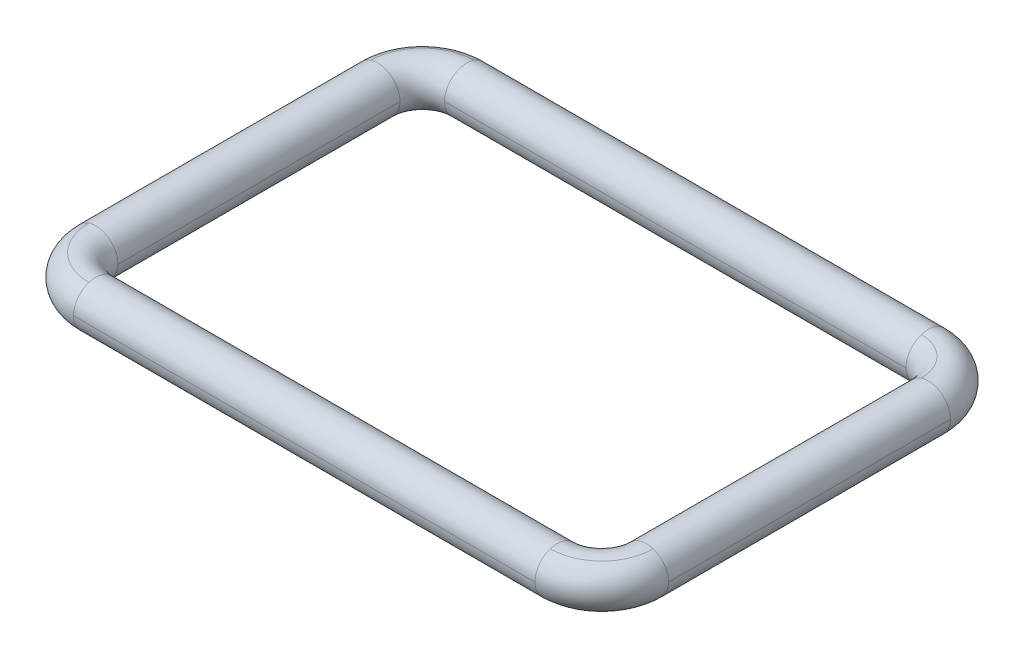
ISO-10303-21;
HEADER;
FILE_DESCRIPTION(('STEP AP214'),'2;1');
FILE_NAME('part.step','',(''),(''),'','','');
FILE_SCHEMA(('AUTOMOTIVE_DESIGN { 1 0 10303 214 1 1 1 1 }'));
ENDSEC;
DATA;
#1=APPLICATION_CONTEXT('core data for automotive mechanical design processes');
#2=APPLICATION_PROTOCOL_DEFINITION('international standard','automotive_design',2000,#1);
#3=PRODUCT_CONTEXT('',#1,'mechanical');
#4=PRODUCT('Part','Part','',(#3));
#5=PRODUCT_RELATED_PRODUCT_CATEGORY('part','',(#4));
#6=PRODUCT_DEFINITION_FORMATION('','',#4);
#7=PRODUCT_DEFINITION_CONTEXT('part definition',#1,'design');
#8=PRODUCT_DEFINITION('design','',#6,#7);
#9=PRODUCT_DEFINITION_SHAPE('','',#8);
#10=(LENGTH_UNIT() NAMED_UNIT(*) SI_UNIT(.MILLI.,.METRE.));
#11=(NAMED_UNIT(*) PLANE_ANGLE_UNIT() SI_UNIT($,.RADIAN.));
#12=(NAMED_UNIT(*) SI_UNIT($,.STERADIAN.) SOLID_ANGLE_UNIT());
#13=UNCERTAINTY_MEASURE_WITH_UNIT(LENGTH_MEASURE(1.E-05),#10,'distance_accuracy_value','');
#14=(GEOMETRIC_REPRESENTATION_CONTEXT(3) GLOBAL_UNCERTAINTY_ASSIGNED_CONTEXT((#13)) GLOBAL_UNIT_ASSIGNED_CONTEXT((#10,
#11,#12)) REPRESENTATION_CONTEXT('',''));
#15=CARTESIAN_POINT('',(0.,0.,0.));
#16=DIRECTION('',(0.,0.,1.));
#17=DIRECTION('',(1.,0.,0.));
#18=AXIS2_PLACEMENT_3D('',#15,#16,#17);
#19=CARTESIAN_POINT('',(0.,0.,9.5));
#20=DIRECTION('',(0.,0.,-1.));
#21=DIRECTION('',(0.,1.,0.));
#22=AXIS2_PLACEMENT_3D('',#19,#20,#21);
#23=CYLINDRICAL_SURFACE('',#22,1.5);
#24=DIRECTION('',(0.,0.,-1.));
#25=VECTOR('',#24,1.);
#26=CARTESIAN_POINT('',(1.5,0.,9.5));
#27=LINE('',#26,#25);
#28=CARTESIAN_POINT('',(1.5,0.,9.5));
#29=VERTEX_POINT('',#28);
#30=CARTESIAN_POINT('',(1.5,0.,-9.5));
#31=VERTEX_POINT('',#30);
#32=EDGE_CURVE('E11',#29,#31,#27,.T.);
#33=ORIENTED_EDGE('',*,*,#32,.F.);
#34=CARTESIAN_POINT('',(0.,0.,9.5));
#35=DIRECTION('',(0.,0.,1.));
#36=DIRECTION('',(1.,0.,0.));
#37=AXIS2_PLACEMENT_3D('',#34,#35,#36);
#38=CIRCLE('',#37,1.5);
#39=CARTESIAN_POINT('',(0.463525491562422,-1.42658477444273,9.5));
#40=VERTEX_POINT('',#39);
#41=EDGE_CURVE('E24',#40,#29,#38,.T.);
#42=ORIENTED_EDGE('',*,*,#41,.F.);
#43=CARTESIAN_POINT('',(0.,0.,9.5));
#44=DIRECTION('',(0.,0.,1.));
#45=DIRECTION('',(1.,0.,0.));
#46=AXIS2_PLACEMENT_3D('',#43,#44,#45);
#47=CIRCLE('',#46,1.5);
#48=CARTESIAN_POINT('',(-1.5,0.,9.5));
#49=VERTEX_POINT('',#48);
#50=EDGE_CURVE('E393',#49,#40,#47,.T.);
#51=ORIENTED_EDGE('',*,*,#50,.F.);
#52=DIRECTION('',(0.,0.,-1.));
#53=VECTOR('',#52,1.);
#54=CARTESIAN_POINT('',(-1.5,0.,9.5));
#55=LINE('',#54,#53);
#56=CARTESIAN_POINT('',(-1.5,0.,-9.5));
#57=VERTEX_POINT('',#56);
#58=EDGE_CURVE('E389',#49,#57,#55,.T.);
#59=ORIENTED_EDGE('',*,*,#58,.T.);
#60=CARTESIAN_POINT('',(0.,0.,-9.5));
#61=DIRECTION('',(0.,0.,1.));
#62=DIRECTION('',(1.,0.,0.));
#63=AXIS2_PLACEMENT_3D('',#60,#61,#62);
#64=CIRCLE('',#63,1.5);
#65=CARTESIAN_POINT('',(0.463525491562421,-1.42658477444273,-9.5));
#66=VERTEX_POINT('',#65);
#67=EDGE_CURVE('E377',#57,#66,#64,.T.);
#68=ORIENTED_EDGE('',*,*,#67,.T.);
#69=CARTESIAN_POINT('',(0.,0.,-9.5));
#70=DIRECTION('',(0.,0.,1.));
#71=DIRECTION('',(1.,0.,0.));
#72=AXIS2_PLACEMENT_3D('',#69,#70,#71);
#73=CIRCLE('',#72,1.5);
#74=EDGE_CURVE('E374',#66,#31,#73,.T.);
#75=ORIENTED_EDGE('',*,*,#74,.T.);
#76=EDGE_LOOP('',(#33,#42,#51,#59,#68,#75));
#77=FACE_BOUND('',#76,.T.);
#78=ADVANCED_FACE('F16',(#77),#23,.T.);
#79=CARTESIAN_POINT('',(3.,0.,-9.5));
#80=DIRECTION('',(0.,1.,0.));
#81=DIRECTION('',(0.707106781186547,0.,0.707106781186548));
#82=AXIS2_PLACEMENT_3D('',#79,#80,#81);
#83=TOROIDAL_SURFACE('',#82,3.,1.5);
#84=CARTESIAN_POINT('',(3.,-1.42658477444273,-9.5));
#85=DIRECTION('',(0.,1.,0.));
#86=DIRECTION('',(0.,0.,-1.));
#87=AXIS2_PLACEMENT_3D('',#84,#85,#86);
#88=CIRCLE('',#87,2.53647450843758);
#89=CARTESIAN_POINT('',(3.,-1.42658477444273,-12.0364745084376));
#90=VERTEX_POINT('',#89);
#91=EDGE_CURVE('E372',#90,#66,#88,.T.);
#92=ORIENTED_EDGE('',*,*,#91,.F.);
#93=CARTESIAN_POINT('',(3.,0.,-12.5));
#94=DIRECTION('',(1.,0.,0.));
#95=DIRECTION('',(0.,0.,-1.));
#96=AXIS2_PLACEMENT_3D('',#93,#94,#95);
#97=CIRCLE('',#96,1.5);
#98=CARTESIAN_POINT('',(3.,0.,-11.));
#99=VERTEX_POINT('',#98);
#100=EDGE_CURVE('E143',#99,#90,#97,.T.);
#101=ORIENTED_EDGE('',*,*,#100,.F.);
#102=CARTESIAN_POINT('',(3.,0.,-12.5));
#103=DIRECTION('',(1.,0.,0.));
#104=DIRECTION('',(0.,0.,-1.));
#105=AXIS2_PLACEMENT_3D('',#102,#103,#104);
#106=CIRCLE('',#105,1.5);
#107=CARTESIAN_POINT('',(3.,1.42658477444273,-12.9635254915624));
#108=VERTEX_POINT('',#107);
#109=EDGE_CURVE('E379',#108,#99,#106,.T.);
#110=ORIENTED_EDGE('',*,*,#109,.F.);
#111=CARTESIAN_POINT('',(3.,1.42658477444273,-12.9635254915624));
#112=CARTESIAN_POINT('',(2.94332813943827,1.42658477444273,-12.9635266937132));
#113=CARTESIAN_POINT('',(2.88665638116779,1.42658477444273,-12.9621345990384));
#114=CARTESIAN_POINT('',(2.77344933714281,1.42658477444273,-12.9565724478083));
#115=CARTESIAN_POINT('',(2.7169140513883,1.42658477444273,-12.9524023912529));
#116=CARTESIAN_POINT('',(2.60411622032872,1.42658477444273,-12.9412929480325));
#117=CARTESIAN_POINT('',(2.54785367502364,1.42658477444273,-12.9343535613675));
#118=CARTESIAN_POINT('',(2.43573684764596,1.42658477444273,-12.917722554468));
#119=CARTESIAN_POINT('',(2.37988256557335,1.42658477444273,-12.9080309342336));
#120=CARTESIAN_POINT('',(2.26871682750668,1.42658477444273,-12.885918706618));
#121=CARTESIAN_POINT('',(2.21340537151262,1.42658477444273,-12.8734980992368));
#122=CARTESIAN_POINT('',(2.10345853440862,1.42658477444273,-12.8459578468663));
#123=CARTESIAN_POINT('',(2.04882315329869,1.42658477444273,-12.8308382018769));
#124=CARTESIAN_POINT('',(1.9403600877397,1.42658477444273,-12.7979362915487));
#125=CARTESIAN_POINT('',(1.88653240329063,1.42658477444273,-12.78015402621));
#126=CARTESIAN_POINT('',(1.779814406564,1.42658477444273,-12.7419697161714));
#127=CARTESIAN_POINT('',(1.72692409428642,1.42658477444273,-12.7215676714715));
#128=CARTESIAN_POINT('',(1.62220825932339,1.42658477444273,-12.6781929524998));
#129=CARTESIAN_POINT('',(1.57038273663794,1.42658477444273,-12.6552202782279));
#130=CARTESIAN_POINT('',(1.46792133307579,1.42658477444273,-12.6067596434371));
#131=CARTESIAN_POINT('',(1.4172854521991,1.42658477444273,-12.5812716829182));
#132=CARTESIAN_POINT('',(1.31732531852853,1.42658477444273,-12.5278418783248));
#133=CARTESIAN_POINT('',(1.26800106573465,1.42658477444273,-12.4999000342505));
#134=CARTESIAN_POINT('',(1.1707830146745,1.42658477444273,-12.4416297769062));
#135=CARTESIAN_POINT('',(1.12288921640823,1.42658477444273,-12.4113013636364));
#136=CARTESIAN_POINT('',(1.02864745475843,1.42658477444273,-12.3483310317024));
#137=CARTESIAN_POINT('',(0.982299491374914,1.42658477444273,-12.3156891130384));
#138=CARTESIAN_POINT('',(0.891261055793987,1.42658477444273,-12.2481704075579));
#139=CARTESIAN_POINT('',(0.846570583596581,1.42658477444273,-12.2132936207415));
#140=CARTESIAN_POINT('',(0.758954793649837,1.42658477444273,-12.1413892001906));
#141=CARTESIAN_POINT('',(0.7160294759005,1.42658477444273,-12.104361566456));
#142=CARTESIAN_POINT('',(0.632047405700165,1.42658477444273,-12.0282446548815));
#143=CARTESIAN_POINT('',(0.590990653249167,1.42658477444273,-11.9891553770417));
#144=CARTESIAN_POINT('',(0.510844622958314,1.42658477444273,-11.9090093467508));
#145=CARTESIAN_POINT('',(0.471755345118459,1.42658477444273,-11.8679525942998));
#146=CARTESIAN_POINT('',(0.395638433544012,1.42658477444273,-11.7839705240995));
#147=CARTESIAN_POINT('',(0.35861079980942,1.42658477444273,-11.7410452063502));
#148=CARTESIAN_POINT('',(0.286706379258453,1.42658477444273,-11.6534294164034));
#149=CARTESIAN_POINT('',(0.251829592442078,1.42658477444273,-11.608738944206));
#150=CARTESIAN_POINT('',(0.184310886961641,1.42658477444273,-11.5177005086251));
#151=CARTESIAN_POINT('',(0.151668968297578,1.42658477444273,-11.4713525452416));
#152=CARTESIAN_POINT('',(0.0886986363636429,1.42658477444273,-11.3771107835918));
#153=CARTESIAN_POINT('',(0.0583702230937702,1.42658477444273,-11.3292169853255));
#154=CARTESIAN_POINT('',(9.99657495396515E-05,1.42658477444273,-11.2319989342653));
#155=CARTESIAN_POINT('',(-0.0278418783248182,1.42658477444273,-11.1826746814715));
#156=CARTESIAN_POINT('',(-0.0812716829181587,1.42658477444273,-11.0827145478009));
#157=CARTESIAN_POINT('',(-0.106759643437142,1.42658477444273,-11.0320786669242));
#158=CARTESIAN_POINT('',(-0.155220278227939,1.42658477444273,-10.9296172633621));
#159=CARTESIAN_POINT('',(-0.178192952499753,1.42658477444273,-10.8777917406766));
#160=CARTESIAN_POINT('',(-0.221567671471476,1.42658477444273,-10.7730759057136));
#161=CARTESIAN_POINT('',(-0.241969716171385,1.42658477444273,-10.720185593436));
#162=CARTESIAN_POINT('',(-0.28015402621002,1.42658477444273,-10.6134675967094));
#163=CARTESIAN_POINT('',(-0.297936291548746,1.42658477444273,-10.5596399122603));
#164=CARTESIAN_POINT('',(-0.330838201876868,1.42658477444273,-10.4511768467013));
#165=CARTESIAN_POINT('',(-0.345957846866265,1.42658477444273,-10.3965414655914));
#166=CARTESIAN_POINT('',(-0.373498099236823,1.42658477444273,-10.2865946284874));
#167=CARTESIAN_POINT('',(-0.385918706617985,1.42658477444273,-10.2312831724933));
#168=CARTESIAN_POINT('',(-0.408030934233587,1.42658477444273,-10.1201174344266));
#169=CARTESIAN_POINT('',(-0.417722554468028,1.42658477444273,-10.064263152354));
#170=CARTESIAN_POINT('',(-0.434353561367509,1.42658477444273,-9.95214632497635));
#171=CARTESIAN_POINT('',(-0.441292948032549,1.42658477444273,-9.89588377967127));
#172=CARTESIAN_POINT('',(-0.452402391252921,1.42658477444273,-9.78308594861169));
#173=CARTESIAN_POINT('',(-0.456572447808252,1.42658477444273,-9.72655066285719));
#174=CARTESIAN_POINT('',(-0.462134599038413,1.42658477444273,-9.61334361883221));
#175=CARTESIAN_POINT('',(-0.463526693713241,1.42658477444273,-9.55667186056173));
#176=CARTESIAN_POINT('',(-0.463525491562421,1.42658477444273,-9.5));
#177=B_SPLINE_CURVE_WITH_KNOTS('',3,(#111,#112,#113,#114,#115,#116,#117,#118,#119,#120,#121,
#122,#123,#124,#125,#126,#127,#128,#129,#130,#131,#132,#133,#134,#135,#136,#137,#138,#139,#140,
#141,#142,#143,#144,#145,#146,#147,#148,#149,#150,#151,#152,#153,#154,#155,#156,#157,#158,#159,
#160,#161,#162,#163,#164,#165,#166,#167,#168,#169,#170,#171,#172,#173,#174,#175,#176),
.UNSPECIFIED.,.F.,.F.,(4,2,2,2,2,2,2,2,2,2,2,2,2,2,2,2,2,2,2,2,2,2,2,2,2,2,2,2,2,2,2,2,4),(0.,
0.16999834116673,0.339996682333461,0.509995023500193,0.679993364666923,0.849991705833654,
1.01999004700039,1.18998838816712,1.35998672933385,1.52998507050058,1.69998341166731,
1.86998175283404,2.03998009400077,2.2099784351675,2.37997677633423,2.54997511750096,
2.71997345866769,2.88997179983442,3.05997014100115,3.22996848216789,3.39996682333462,
3.56996516450135,3.73996350566808,3.90996184683481,4.07996018800154,4.24995852916827,
4.419956870335,4.58995521150173,4.75995355266846,4.92995189383519,5.09995023500192,
5.26994857616865,5.43994691733538),.UNSPECIFIED.);
#178=CARTESIAN_POINT('',(-0.463525491562421,1.42658477444273,-9.5));
#179=VERTEX_POINT('',#178);
#180=EDGE_CURVE('E151',#108,#179,#177,.T.);
#181=ORIENTED_EDGE('',*,*,#180,.T.);
#182=CARTESIAN_POINT('',(0.,0.,-9.5));
#183=DIRECTION('',(0.,0.,1.));
#184=DIRECTION('',(1.,0.,0.));
#185=AXIS2_PLACEMENT_3D('',#182,#183,#184);
#186=CIRCLE('',#185,1.5);
#187=EDGE_CURVE('E345',#31,#179,#186,.T.);
#188=ORIENTED_EDGE('',*,*,#187,.F.);
#189=ORIENTED_EDGE('',*,*,#74,.F.);
#190=EDGE_LOOP('',(#92,#101,#110,#181,#188,#189));
#191=FACE_BOUND('',#190,.T.);
#192=ADVANCED_FACE('F356',(#191),#83,.T.);
#193=CARTESIAN_POINT('',(0.,0.,9.5));
#194=DIRECTION('',(0.,0.,-1.));
#195=DIRECTION('',(0.,-1.,0.));
#196=AXIS2_PLACEMENT_3D('',#193,#194,#195);
#197=CYLINDRICAL_SURFACE('',#196,1.5);
#198=ORIENTED_EDGE('',*,*,#32,.T.);
#199=ORIENTED_EDGE('',*,*,#187,.T.);
#200=CARTESIAN_POINT('',(0.,0.,-9.5));
#201=DIRECTION('',(0.,0.,1.));
#202=DIRECTION('',(1.,0.,0.));
#203=AXIS2_PLACEMENT_3D('',#200,#201,#202);
#204=CIRCLE('',#203,1.5);
#205=EDGE_CURVE('E340',#179,#57,#204,.T.);
#206=ORIENTED_EDGE('',*,*,#205,.T.);
#207=ORIENTED_EDGE('',*,*,#58,.F.);
#208=CARTESIAN_POINT('',(0.,0.,9.5));
#209=DIRECTION('',(0.,0.,1.));
#210=DIRECTION('',(1.,0.,0.));
#211=AXIS2_PLACEMENT_3D('',#208,#209,#210);
#212=CIRCLE('',#211,1.5);
#213=CARTESIAN_POINT('',(-0.463525491562421,1.42658477444273,9.49999999999999));
#214=VERTEX_POINT('',#213);
#215=EDGE_CURVE('E335',#214,#49,#212,.T.);
#216=ORIENTED_EDGE('',*,*,#215,.F.);
#217=CARTESIAN_POINT('',(0.,0.,9.5));
#218=DIRECTION('',(0.,0.,1.));
#219=DIRECTION('',(1.,0.,0.));
#220=AXIS2_PLACEMENT_3D('',#217,#218,#219);
#221=CIRCLE('',#220,1.5);
#222=EDGE_CURVE('E331',#29,#214,#221,.T.);
#223=ORIENTED_EDGE('',*,*,#222,.F.);
#224=EDGE_LOOP('',(#198,#199,#206,#207,#216,#223));
#225=FACE_BOUND('',#224,.T.);
#226=ADVANCED_FACE('F310',(#225),#197,.T.);
#227=CARTESIAN_POINT('',(3.,0.,9.5));
#228=DIRECTION('',(0.,1.,0.));
#229=DIRECTION('',(0.707106781186548,0.,-0.707106781186547));
#230=AXIS2_PLACEMENT_3D('',#227,#228,#229);
#231=TOROIDAL_SURFACE('',#230,3.,1.5);
#232=CARTESIAN_POINT('',(3.,-1.42658477444273,9.5));
#233=DIRECTION('',(0.,1.,0.));
#234=DIRECTION('',(-1.,0.,0.));
#235=AXIS2_PLACEMENT_3D('',#232,#233,#234);
#236=CIRCLE('',#235,2.53647450843758);
#237=CARTESIAN_POINT('',(3.,-1.42658477444273,12.0364745084376));
#238=VERTEX_POINT('',#237);
#239=EDGE_CURVE('E328',#40,#238,#236,.T.);
#240=ORIENTED_EDGE('',*,*,#239,.F.);
#241=ORIENTED_EDGE('',*,*,#41,.T.);
#242=ORIENTED_EDGE('',*,*,#222,.T.);
#243=CARTESIAN_POINT('',(-0.463525491562421,1.42658477444273,9.5));
#244=CARTESIAN_POINT('',(-0.463526693713242,1.42658477444273,9.55667186056173));
#245=CARTESIAN_POINT('',(-0.462134599038413,1.42658477444273,9.61334361883221));
#246=CARTESIAN_POINT('',(-0.456572447808252,1.42658477444273,9.72655066285719));
#247=CARTESIAN_POINT('',(-0.45240239125292,1.42658477444273,9.7830859486117));
#248=CARTESIAN_POINT('',(-0.441292948032548,1.42658477444273,9.89588377967128));
#249=CARTESIAN_POINT('',(-0.434353561367508,1.42658477444273,9.95214632497636));
#250=CARTESIAN_POINT('',(-0.417722554468027,1.42658477444273,10.064263152354));
#251=CARTESIAN_POINT('',(-0.408030934233586,1.42658477444273,10.1201174344266));
#252=CARTESIAN_POINT('',(-0.385918706617984,1.42658477444273,10.2312831724933));
#253=CARTESIAN_POINT('',(-0.373498099236823,1.42658477444273,10.2865946284874));
#254=CARTESIAN_POINT('',(-0.345957846866265,1.42658477444273,10.3965414655914));
#255=CARTESIAN_POINT('',(-0.330838201876867,1.42658477444273,10.4511768467013));
#256=CARTESIAN_POINT('',(-0.297936291548744,1.42658477444273,10.5596399122603));
#257=CARTESIAN_POINT('',(-0.280154026210019,1.42658477444273,10.6134675967094));
#258=CARTESIAN_POINT('',(-0.241969716171384,1.42658477444273,10.720185593436));
#259=CARTESIAN_POINT('',(-0.221567671471475,1.42658477444273,10.7730759057136));
#260=CARTESIAN_POINT('',(-0.178192952499751,1.42658477444273,10.8777917406766));
#261=CARTESIAN_POINT('',(-0.155220278227937,1.42658477444273,10.9296172633621));
#262=CARTESIAN_POINT('',(-0.106759643437139,1.42658477444273,11.0320786669242));
#263=CARTESIAN_POINT('',(-0.0812716829181566,1.42658477444273,11.0827145478009));
#264=CARTESIAN_POINT('',(-0.0278418783248162,1.42658477444273,11.1826746814715));
#265=CARTESIAN_POINT('',(9.99657495414743E-05,1.42658477444273,11.2319989342653));
#266=CARTESIAN_POINT('',(0.0583702230937726,1.42658477444273,11.3292169853255));
#267=CARTESIAN_POINT('',(0.088698636363646,1.42658477444273,11.3771107835918));
#268=CARTESIAN_POINT('',(0.151668968297582,1.42658477444273,11.4713525452416));
#269=CARTESIAN_POINT('',(0.184310886961645,1.42658477444273,11.5177005086251));
#270=CARTESIAN_POINT('',(0.251829592442082,1.42658477444273,11.608738944206));
#271=CARTESIAN_POINT('',(0.286706379258457,1.42658477444273,11.6534294164034));
#272=CARTESIAN_POINT('',(0.358610799809423,1.42658477444273,11.7410452063502));
#273=CARTESIAN_POINT('',(0.395638433544015,1.42658477444273,11.7839705240995));
#274=CARTESIAN_POINT('',(0.471755345118462,1.42658477444273,11.8679525942998));
#275=CARTESIAN_POINT('',(0.510844622958317,1.42658477444273,11.9090093467508));
#276=CARTESIAN_POINT('',(0.590990653249171,1.42658477444273,11.9891553770417));
#277=CARTESIAN_POINT('',(0.63204740570017,1.42658477444273,12.0282446548815));
#278=CARTESIAN_POINT('',(0.716029475900505,1.42658477444273,12.104361566456));
#279=CARTESIAN_POINT('',(0.758954793649841,1.42658477444273,12.1413892001906));
#280=CARTESIAN_POINT('',(0.846570583596585,1.42658477444273,12.2132936207415));
#281=CARTESIAN_POINT('',(0.891261055793992,1.42658477444273,12.2481704075579));
#282=CARTESIAN_POINT('',(0.982299491374918,1.42658477444273,12.3156891130384));
#283=CARTESIAN_POINT('',(1.02864745475844,1.42658477444273,12.3483310317024));
#284=CARTESIAN_POINT('',(1.12288921640823,1.42658477444273,12.4113013636364));
#285=CARTESIAN_POINT('',(1.17078301467451,1.42658477444273,12.4416297769062));
#286=CARTESIAN_POINT('',(1.26800106573466,1.42658477444273,12.4999000342505));
#287=CARTESIAN_POINT('',(1.31732531852853,1.42658477444273,12.5278418783248));
#288=CARTESIAN_POINT('',(1.4172854521991,1.42658477444273,12.5812716829182));
#289=CARTESIAN_POINT('',(1.46792133307579,1.42658477444273,12.6067596434371));
#290=CARTESIAN_POINT('',(1.57038273663794,1.42658477444273,12.6552202782279));
#291=CARTESIAN_POINT('',(1.6222082593234,1.42658477444273,12.6781929524998));
#292=CARTESIAN_POINT('',(1.72692409428643,1.42658477444273,12.7215676714715));
#293=CARTESIAN_POINT('',(1.779814406564,1.42658477444273,12.7419697161714));
#294=CARTESIAN_POINT('',(1.88653240329064,1.42658477444273,12.78015402621));
#295=CARTESIAN_POINT('',(1.94036008773971,1.42658477444273,12.7979362915487));
#296=CARTESIAN_POINT('',(2.0488231532987,1.42658477444273,12.8308382018769));
#297=CARTESIAN_POINT('',(2.10345853440863,1.42658477444273,12.8459578468663));
#298=CARTESIAN_POINT('',(2.21340537151262,1.42658477444273,12.8734980992368));
#299=CARTESIAN_POINT('',(2.26871682750669,1.42658477444273,12.885918706618));
#300=CARTESIAN_POINT('',(2.37988256557336,1.42658477444273,12.9080309342336));
#301=CARTESIAN_POINT('',(2.43573684764597,1.42658477444273,12.917722554468));
#302=CARTESIAN_POINT('',(2.54785367502365,1.42658477444273,12.9343535613675));
#303=CARTESIAN_POINT('',(2.60411622032873,1.42658477444273,12.9412929480325));
#304=CARTESIAN_POINT('',(2.71691405138831,1.42658477444273,12.9524023912529));
#305=CARTESIAN_POINT('',(2.77344933714282,1.42658477444273,12.9565724478083));
#306=CARTESIAN_POINT('',(2.8866563811678,1.42658477444273,12.9621345990384));
#307=CARTESIAN_POINT('',(2.94332813943828,1.42658477444273,12.9635266937132));
#308=CARTESIAN_POINT('',(3.,1.42658477444273,12.9635254915624));
#309=B_SPLINE_CURVE_WITH_KNOTS('',3,(#243,#244,#245,#246,#247,#248,#249,#250,#251,#252,#253,
#254,#255,#256,#257,#258,#259,#260,#261,#262,#263,#264,#265,#266,#267,#268,#269,#270,#271,#272,
#273,#274,#275,#276,#277,#278,#279,#280,#281,#282,#283,#284,#285,#286,#287,#288,#289,#290,#291,
#292,#293,#294,#295,#296,#297,#298,#299,#300,#301,#302,#303,#304,#305,#306,#307,#308),
.UNSPECIFIED.,.F.,.F.,(4,2,2,2,2,2,2,2,2,2,2,2,2,2,2,2,2,2,2,2,2,2,2,2,2,2,2,2,2,2,2,2,4),(0.,
0.169998341166731,0.339996682333463,0.509995023500194,0.679993364666923,0.849991705833656,
1.01999004700039,1.18998838816712,1.35998672933385,1.52998507050058,1.69998341166731,
1.86998175283404,2.03998009400077,2.20997843516751,2.37997677633423,2.54997511750096,
2.7199734586677,2.88997179983443,3.05997014100116,3.22996848216789,3.39996682333462,
3.56996516450135,3.73996350566808,3.90996184683481,4.07996018800155,4.24995852916828,
4.41995687033501,4.58995521150174,4.75995355266847,4.9299518938352,5.09995023500193,
5.26994857616866,5.43994691733539),.UNSPECIFIED.);
#310=CARTESIAN_POINT('',(3.,1.42658477444273,12.9635254915624));
#311=VERTEX_POINT('',#310);
#312=EDGE_CURVE('E326',#214,#311,#309,.T.);
#313=ORIENTED_EDGE('',*,*,#312,.T.);
#314=CARTESIAN_POINT('',(3.,0.,12.5));
#315=DIRECTION('',(1.,0.,0.));
#316=DIRECTION('',(0.,0.,-1.));
#317=AXIS2_PLACEMENT_3D('',#314,#315,#316);
#318=CIRCLE('',#317,1.5);
#319=CARTESIAN_POINT('',(3.,0.,11.));
#320=VERTEX_POINT('',#319);
#321=EDGE_CURVE('E464',#320,#311,#318,.T.);
#322=ORIENTED_EDGE('',*,*,#321,.F.);
#323=CARTESIAN_POINT('',(3.,0.,12.5));
#324=DIRECTION('',(1.,0.,0.));
#325=DIRECTION('',(0.,0.,-1.));
#326=AXIS2_PLACEMENT_3D('',#323,#324,#325);
#327=CIRCLE('',#326,1.5);
#328=EDGE_CURVE('E403',#238,#320,#327,.T.);
#329=ORIENTED_EDGE('',*,*,#328,.F.);
#330=EDGE_LOOP('',(#240,#241,#242,#313,#322,#329));
#331=FACE_BOUND('',#330,.T.);
#332=ADVANCED_FACE('F305',(#331),#231,.T.);
#333=CARTESIAN_POINT('',(34.09,0.,12.5));
#334=DIRECTION('',(-1.,0.,0.));
#335=DIRECTION('',(0.,1.,0.));
#336=AXIS2_PLACEMENT_3D('',#333,#334,#335);
#337=CYLINDRICAL_SURFACE('',#336,1.5);
#338=DIRECTION('',(-1.,0.,0.));
#339=VECTOR('',#338,1.);
#340=CARTESIAN_POINT('',(34.09,0.,11.));
#341=LINE('',#340,#339);
#342=CARTESIAN_POINT('',(34.09,0.,11.));
#343=VERTEX_POINT('',#342);
#344=EDGE_CURVE('E450',#343,#320,#341,.T.);
#345=ORIENTED_EDGE('',*,*,#344,.F.);
#346=CARTESIAN_POINT('',(34.09,0.,12.5));
#347=DIRECTION('',(1.,0.,0.));
#348=DIRECTION('',(0.,0.,-1.));
#349=AXIS2_PLACEMENT_3D('',#346,#347,#348);
#350=CIRCLE('',#349,1.5);
#351=CARTESIAN_POINT('',(34.09,-1.42658477444273,12.0364745084376));
#352=VERTEX_POINT('',#351);
#353=EDGE_CURVE('E448',#352,#343,#350,.T.);
#354=ORIENTED_EDGE('',*,*,#353,.F.);
#355=CARTESIAN_POINT('',(34.09,0.,12.5));
#356=DIRECTION('',(1.,0.,0.));
#357=DIRECTION('',(0.,0.,-1.));
#358=AXIS2_PLACEMENT_3D('',#355,#356,#357);
#359=CIRCLE('',#358,1.5);
#360=CARTESIAN_POINT('',(34.09,0.,14.));
#361=VERTEX_POINT('',#360);
#362=EDGE_CURVE('E446',#361,#352,#359,.T.);
#363=ORIENTED_EDGE('',*,*,#362,.F.);
#364=DIRECTION('',(-1.,0.,0.));
#365=VECTOR('',#364,1.);
#366=CARTESIAN_POINT('',(34.09,0.,14.));
#367=LINE('',#366,#365);
#368=CARTESIAN_POINT('',(3.,0.,14.));
#369=VERTEX_POINT('',#368);
#370=EDGE_CURVE('E454',#361,#369,#367,.T.);
#371=ORIENTED_EDGE('',*,*,#370,.T.);
#372=CARTESIAN_POINT('',(3.,0.,12.5));
#373=DIRECTION('',(1.,0.,0.));
#374=DIRECTION('',(0.,0.,-1.));
#375=AXIS2_PLACEMENT_3D('',#372,#373,#374);
#376=CIRCLE('',#375,1.5);
#377=EDGE_CURVE('E470',#369,#238,#376,.T.);
#378=ORIENTED_EDGE('',*,*,#377,.T.);
#379=ORIENTED_EDGE('',*,*,#328,.T.);
#380=EDGE_LOOP('',(#345,#354,#363,#371,#378,#379));
#381=FACE_BOUND('',#380,.T.);
#382=ADVANCED_FACE('F301',(#381),#337,.T.);
#383=CARTESIAN_POINT('',(3.,0.,9.5));
#384=DIRECTION('',(0.,1.,0.));
#385=DIRECTION('',(0.707106781186548,0.,-0.707106781186547));
#386=AXIS2_PLACEMENT_3D('',#383,#384,#385);
#387=TOROIDAL_SURFACE('',#386,3.,1.5);
#388=ORIENTED_EDGE('',*,*,#239,.T.);
#389=ORIENTED_EDGE('',*,*,#377,.F.);
#390=CARTESIAN_POINT('',(3.,0.,12.5));
#391=DIRECTION('',(1.,0.,0.));
#392=DIRECTION('',(0.,0.,-1.));
#393=AXIS2_PLACEMENT_3D('',#390,#391,#392);
#394=CIRCLE('',#393,1.5);
#395=EDGE_CURVE('E284',#311,#369,#394,.T.);
#396=ORIENTED_EDGE('',*,*,#395,.F.);
#397=ORIENTED_EDGE('',*,*,#312,.F.);
#398=ORIENTED_EDGE('',*,*,#215,.T.);
#399=ORIENTED_EDGE('',*,*,#50,.T.);
#400=EDGE_LOOP('',(#388,#389,#396,#397,#398,#399));
#401=FACE_BOUND('',#400,.T.);
#402=ADVANCED_FACE('F292',(#401),#387,.T.);
#403=CARTESIAN_POINT('',(34.09,0.,12.5));
#404=DIRECTION('',(-1.,0.,0.));
#405=DIRECTION('',(0.,-1.,0.));
#406=AXIS2_PLACEMENT_3D('',#403,#404,#405);
#407=CYLINDRICAL_SURFACE('',#406,1.5);
#408=ORIENTED_EDGE('',*,*,#344,.T.);
#409=ORIENTED_EDGE('',*,*,#321,.T.);
#410=ORIENTED_EDGE('',*,*,#395,.T.);
#411=ORIENTED_EDGE('',*,*,#370,.F.);
#412=CARTESIAN_POINT('',(34.09,0.,12.5));
#413=DIRECTION('',(1.,0.,0.));
#414=DIRECTION('',(0.,0.,-1.));
#415=AXIS2_PLACEMENT_3D('',#412,#413,#414);
#416=CIRCLE('',#415,1.5);
#417=CARTESIAN_POINT('',(34.09,1.42658477444273,12.9635254915624));
#418=VERTEX_POINT('',#417);
#419=EDGE_CURVE('E279',#418,#361,#416,.T.);
#420=ORIENTED_EDGE('',*,*,#419,.F.);
#421=CARTESIAN_POINT('',(34.09,0.,12.5));
#422=DIRECTION('',(1.,0.,0.));
#423=DIRECTION('',(0.,0.,-1.));
#424=AXIS2_PLACEMENT_3D('',#421,#422,#423);
#425=CIRCLE('',#424,1.5);
#426=EDGE_CURVE('E275',#343,#418,#425,.T.);
#427=ORIENTED_EDGE('',*,*,#426,.F.);
#428=EDGE_LOOP('',(#408,#409,#410,#411,#420,#427));
#429=FACE_BOUND('',#428,.T.);
#430=ADVANCED_FACE('F253',(#429),#407,.T.);
#431=CARTESIAN_POINT('',(34.09,0.,9.5));
#432=DIRECTION('',(0.,1.,0.));
#433=DIRECTION('',(-0.707106781186547,0.,-0.707106781186548));
#434=AXIS2_PLACEMENT_3D('',#431,#432,#433);
#435=TOROIDAL_SURFACE('',#434,3.,1.5);
#436=CARTESIAN_POINT('',(34.09,-1.42658477444273,9.5));
#437=DIRECTION('',(0.,1.,0.));
#438=DIRECTION('',(0.,0.,1.));
#439=AXIS2_PLACEMENT_3D('',#436,#437,#438);
#440=CIRCLE('',#439,2.53647450843758);
#441=CARTESIAN_POINT('',(36.6264745084376,-1.42658477444273,9.5));
#442=VERTEX_POINT('',#441);
#443=EDGE_CURVE('E272',#352,#442,#440,.T.);
#444=ORIENTED_EDGE('',*,*,#443,.F.);
#445=ORIENTED_EDGE('',*,*,#353,.T.);
#446=ORIENTED_EDGE('',*,*,#426,.T.);
#447=CARTESIAN_POINT('',(34.09,1.42658477444273,12.9635254915624));
#448=CARTESIAN_POINT('',(34.1466718605617,1.42658477444273,12.9635266937132));
#449=CARTESIAN_POINT('',(34.2033436188322,1.42658477444273,12.9621345990384));
#450=CARTESIAN_POINT('',(34.3165506628572,1.42658477444273,12.9565724478083));
#451=CARTESIAN_POINT('',(34.3730859486117,1.42658477444273,12.9524023912529));
#452=CARTESIAN_POINT('',(34.4858837796713,1.42658477444273,12.9412929480325));
#453=CARTESIAN_POINT('',(34.5421463249764,1.42658477444273,12.9343535613675));
#454=CARTESIAN_POINT('',(34.654263152354,1.42658477444273,12.917722554468));
#455=CARTESIAN_POINT('',(34.7101174344266,1.42658477444273,12.9080309342336));
#456=CARTESIAN_POINT('',(34.8212831724933,1.42658477444273,12.885918706618));
#457=CARTESIAN_POINT('',(34.8765946284874,1.42658477444273,12.8734980992368));
#458=CARTESIAN_POINT('',(34.9865414655914,1.42658477444273,12.8459578468663));
#459=CARTESIAN_POINT('',(35.0411768467013,1.42658477444273,12.8308382018769));
#460=CARTESIAN_POINT('',(35.1496399122603,1.42658477444273,12.7979362915487));
#461=CARTESIAN_POINT('',(35.2034675967094,1.42658477444273,12.78015402621));
#462=CARTESIAN_POINT('',(35.310185593436,1.42658477444273,12.7419697161714));
#463=CARTESIAN_POINT('',(35.3630759057136,1.42658477444273,12.7215676714715));
#464=CARTESIAN_POINT('',(35.4677917406766,1.42658477444273,12.6781929524997));
#465=CARTESIAN_POINT('',(35.5196172633621,1.42658477444273,12.6552202782279));
#466=CARTESIAN_POINT('',(35.6220786669242,1.42658477444273,12.6067596434371));
#467=CARTESIAN_POINT('',(35.6727145478009,1.42658477444273,12.5812716829182));
#468=CARTESIAN_POINT('',(35.7726746814715,1.42658477444273,12.5278418783248));
#469=CARTESIAN_POINT('',(35.8219989342654,1.42658477444273,12.4999000342505));
#470=CARTESIAN_POINT('',(35.9192169853255,1.42658477444273,12.4416297769062));
#471=CARTESIAN_POINT('',(35.9671107835918,1.42658477444273,12.4113013636364));
#472=CARTESIAN_POINT('',(36.0613525452416,1.42658477444273,12.3483310317024));
#473=CARTESIAN_POINT('',(36.1077005086251,1.42658477444273,12.3156891130384));
#474=CARTESIAN_POINT('',(36.198738944206,1.42658477444273,12.2481704075579));
#475=CARTESIAN_POINT('',(36.2434294164034,1.42658477444273,12.2132936207415));
#476=CARTESIAN_POINT('',(36.3310452063502,1.42658477444273,12.1413892001906));
#477=CARTESIAN_POINT('',(36.3739705240995,1.42658477444273,12.104361566456));
#478=CARTESIAN_POINT('',(36.4579525942998,1.42658477444273,12.0282446548815));
#479=CARTESIAN_POINT('',(36.4990093467508,1.42658477444273,11.9891553770417));
#480=CARTESIAN_POINT('',(36.5791553770417,1.42658477444273,11.9090093467508));
#481=CARTESIAN_POINT('',(36.6182446548815,1.42658477444273,11.8679525942998));
#482=CARTESIAN_POINT('',(36.694361566456,1.42658477444273,11.7839705240995));
#483=CARTESIAN_POINT('',(36.7313892001906,1.42658477444273,11.7410452063502));
#484=CARTESIAN_POINT('',(36.8032936207415,1.42658477444273,11.6534294164034));
#485=CARTESIAN_POINT('',(36.8381704075579,1.42658477444273,11.608738944206));
#486=CARTESIAN_POINT('',(36.9056891130384,1.42658477444273,11.5177005086251));
#487=CARTESIAN_POINT('',(36.9383310317024,1.42658477444273,11.4713525452416));
#488=CARTESIAN_POINT('',(37.0013013636364,1.42658477444273,11.3771107835918));
#489=CARTESIAN_POINT('',(37.0316297769062,1.42658477444273,11.3292169853255));
#490=CARTESIAN_POINT('',(37.0899000342505,1.42658477444273,11.2319989342653));
#491=CARTESIAN_POINT('',(37.1178418783248,1.42658477444273,11.1826746814715));
#492=CARTESIAN_POINT('',(37.1712716829182,1.42658477444273,11.0827145478009));
#493=CARTESIAN_POINT('',(37.1967596434371,1.42658477444273,11.0320786669242));
#494=CARTESIAN_POINT('',(37.2452202782279,1.42658477444273,10.9296172633621));
#495=CARTESIAN_POINT('',(37.2681929524998,1.42658477444273,10.8777917406766));
#496=CARTESIAN_POINT('',(37.3115676714715,1.42658477444273,10.7730759057136));
#497=CARTESIAN_POINT('',(37.3319697161714,1.42658477444273,10.720185593436));
#498=CARTESIAN_POINT('',(37.37015402621,1.42658477444273,10.6134675967094));
#499=CARTESIAN_POINT('',(37.3879362915487,1.42658477444273,10.5596399122603));
#500=CARTESIAN_POINT('',(37.4208382018769,1.42658477444273,10.4511768467013));
#501=CARTESIAN_POINT('',(37.4359578468663,1.42658477444273,10.3965414655914));
#502=CARTESIAN_POINT('',(37.4634980992368,1.42658477444273,10.2865946284874));
#503=CARTESIAN_POINT('',(37.475918706618,1.42658477444273,10.2312831724933));
#504=CARTESIAN_POINT('',(37.4980309342336,1.42658477444273,10.1201174344266));
#505=CARTESIAN_POINT('',(37.507722554468,1.42658477444273,10.064263152354));
#506=CARTESIAN_POINT('',(37.5243535613675,1.42658477444273,9.95214632497635));
#507=CARTESIAN_POINT('',(37.5312929480326,1.42658477444273,9.89588377967127));
#508=CARTESIAN_POINT('',(37.5424023912529,1.42658477444273,9.78308594861169));
#509=CARTESIAN_POINT('',(37.5465724478083,1.42658477444273,9.72655066285718));
#510=CARTESIAN_POINT('',(37.5521345990384,1.42658477444273,9.6133436188322));
#511=CARTESIAN_POINT('',(37.5535266937132,1.42658477444273,9.55667186056173));
#512=CARTESIAN_POINT('',(37.5535254915624,1.42658477444273,9.5));
#513=B_SPLINE_CURVE_WITH_KNOTS('',3,(#447,#448,#449,#450,#451,#452,#453,#454,#455,#456,#457,
#458,#459,#460,#461,#462,#463,#464,#465,#466,#467,#468,#469,#470,#471,#472,#473,#474,#475,#476,
#477,#478,#479,#480,#481,#482,#483,#484,#485,#486,#487,#488,#489,#490,#491,#492,#493,#494,#495,
#496,#497,#498,#499,#500,#501,#502,#503,#504,#505,#506,#507,#508,#509,#510,#511,#512),
.UNSPECIFIED.,.F.,.F.,(4,2,2,2,2,2,2,2,2,2,2,2,2,2,2,2,2,2,2,2,2,2,2,2,2,2,2,2,2,2,2,2,4),(0.,
0.169998341166729,0.339996682333466,0.509995023500196,0.679993364666923,0.849991705833658,
1.01999004700039,1.18998838816712,1.35998672933385,1.52998507050058,1.69998341166731,
1.86998175283404,2.03998009400077,2.2099784351675,2.37997677633423,2.54997511750096,
2.71997345866769,2.88997179983442,3.05997014100115,3.22996848216788,3.39996682333462,
3.56996516450135,3.73996350566808,3.90996184683481,4.07996018800154,4.24995852916827,
4.419956870335,4.58995521150173,4.75995355266846,4.92995189383519,5.09995023500193,
5.26994857616865,5.43994691733539),.UNSPECIFIED.);
#514=CARTESIAN_POINT('',(37.5535254915624,1.42658477444273,9.5));
#515=VERTEX_POINT('',#514);
#516=EDGE_CURVE('E270',#418,#515,#513,.T.);
#517=ORIENTED_EDGE('',*,*,#516,.T.);
#518=CARTESIAN_POINT('',(37.09,0.,9.5));
#519=DIRECTION('',(0.,0.,-1.));
#520=DIRECTION('',(-1.,0.,0.));
#521=AXIS2_PLACEMENT_3D('',#518,#519,#520);
#522=CIRCLE('',#521,1.5);
#523=CARTESIAN_POINT('',(35.59,0.,9.5));
#524=VERTEX_POINT('',#523);
#525=EDGE_CURVE('E436',#524,#515,#522,.T.);
#526=ORIENTED_EDGE('',*,*,#525,.F.);
#527=CARTESIAN_POINT('',(37.09,0.,9.5));
#528=DIRECTION('',(0.,0.,-1.));
#529=DIRECTION('',(-1.,0.,0.));
#530=AXIS2_PLACEMENT_3D('',#527,#528,#529);
#531=CIRCLE('',#530,1.5);
#532=EDGE_CURVE('E431',#442,#524,#531,.T.);
#533=ORIENTED_EDGE('',*,*,#532,.F.);
#534=EDGE_LOOP('',(#444,#445,#446,#517,#526,#533));
#535=FACE_BOUND('',#534,.T.);
#536=ADVANCED_FACE('F248',(#535),#435,.T.);
#537=CARTESIAN_POINT('',(37.09,0.,-9.5));
#538=DIRECTION('',(0.,0.,1.));
#539=DIRECTION('',(0.,1.,0.));
#540=AXIS2_PLACEMENT_3D('',#537,#538,#539);
#541=CYLINDRICAL_SURFACE('',#540,1.5);
#542=DIRECTION('',(0.,0.,1.));
#543=VECTOR('',#542,1.);
#544=CARTESIAN_POINT('',(35.59,0.,-9.5));
#545=LINE('',#544,#543);
#546=CARTESIAN_POINT('',(35.59,0.,-9.5));
#547=VERTEX_POINT('',#546);
#548=EDGE_CURVE('E418',#547,#524,#545,.T.);
#549=ORIENTED_EDGE('',*,*,#548,.F.);
#550=CARTESIAN_POINT('',(37.09,0.,-9.5));
#551=DIRECTION('',(0.,0.,1.));
#552=DIRECTION('',(1.,0.,0.));
#553=AXIS2_PLACEMENT_3D('',#550,#551,#552);
#554=CIRCLE('',#553,1.5);
#555=CARTESIAN_POINT('',(37.5535254915624,-1.42658477444273,-9.5));
#556=VERTEX_POINT('',#555);
#557=EDGE_CURVE('E415',#547,#556,#554,.T.);
#558=ORIENTED_EDGE('',*,*,#557,.T.);
#559=CARTESIAN_POINT('',(37.09,0.,-9.5));
#560=DIRECTION('',(0.,0.,1.));
#561=DIRECTION('',(1.,0.,0.));
#562=AXIS2_PLACEMENT_3D('',#559,#560,#561);
#563=CIRCLE('',#562,1.5);
#564=CARTESIAN_POINT('',(38.59,0.,-9.5));
#565=VERTEX_POINT('',#564);
#566=EDGE_CURVE('E413',#556,#565,#563,.T.);
#567=ORIENTED_EDGE('',*,*,#566,.T.);
#568=DIRECTION('',(0.,0.,1.));
#569=VECTOR('',#568,1.);
#570=CARTESIAN_POINT('',(38.59,0.,-9.5));
#571=LINE('',#570,#569);
#572=CARTESIAN_POINT('',(38.59,0.,9.5));
#573=VERTEX_POINT('',#572);
#574=EDGE_CURVE('E416',#565,#573,#571,.T.);
#575=ORIENTED_EDGE('',*,*,#574,.T.);
#576=CARTESIAN_POINT('',(37.09,0.,9.5));
#577=DIRECTION('',(0.,0.,-1.));
#578=DIRECTION('',(-1.,0.,0.));
#579=AXIS2_PLACEMENT_3D('',#576,#577,#578);
#580=CIRCLE('',#579,1.5);
#581=EDGE_CURVE('E420',#573,#442,#580,.T.);
#582=ORIENTED_EDGE('',*,*,#581,.T.);
#583=ORIENTED_EDGE('',*,*,#532,.T.);
#584=EDGE_LOOP('',(#549,#558,#567,#575,#582,#583));
#585=FACE_BOUND('',#584,.T.);
#586=ADVANCED_FACE('F244',(#585),#541,.T.);
#587=CARTESIAN_POINT('',(34.09,0.,9.5));
#588=DIRECTION('',(0.,1.,0.));
#589=DIRECTION('',(-0.707106781186547,0.,-0.707106781186548));
#590=AXIS2_PLACEMENT_3D('',#587,#588,#589);
#591=TOROIDAL_SURFACE('',#590,3.,1.5);
#592=ORIENTED_EDGE('',*,*,#443,.T.);
#593=ORIENTED_EDGE('',*,*,#581,.F.);
#594=CARTESIAN_POINT('',(37.09,0.,9.5));
#595=DIRECTION('',(0.,0.,-1.));
#596=DIRECTION('',(-1.,0.,0.));
#597=AXIS2_PLACEMENT_3D('',#594,#595,#596);
#598=CIRCLE('',#597,1.5);
#599=EDGE_CURVE('E227',#515,#573,#598,.T.);
#600=ORIENTED_EDGE('',*,*,#599,.F.);
#601=ORIENTED_EDGE('',*,*,#516,.F.);
#602=ORIENTED_EDGE('',*,*,#419,.T.);
#603=ORIENTED_EDGE('',*,*,#362,.T.);
#604=EDGE_LOOP('',(#592,#593,#600,#601,#602,#603));
#605=FACE_BOUND('',#604,.T.);
#606=ADVANCED_FACE('F235',(#605),#591,.T.);
#607=CARTESIAN_POINT('',(37.09,0.,-9.5));
#608=DIRECTION('',(0.,0.,1.));
#609=DIRECTION('',(0.,-1.,0.));
#610=AXIS2_PLACEMENT_3D('',#607,#608,#609);
#611=CYLINDRICAL_SURFACE('',#610,1.5);
#612=ORIENTED_EDGE('',*,*,#548,.T.);
#613=ORIENTED_EDGE('',*,*,#525,.T.);
#614=ORIENTED_EDGE('',*,*,#599,.T.);
#615=ORIENTED_EDGE('',*,*,#574,.F.);
#616=CARTESIAN_POINT('',(37.09,0.,-9.5));
#617=DIRECTION('',(0.,0.,1.));
#618=DIRECTION('',(1.,0.,0.));
#619=AXIS2_PLACEMENT_3D('',#616,#617,#618);
#620=CIRCLE('',#619,1.5);
#621=CARTESIAN_POINT('',(36.6264745084376,1.42658477444273,-9.5));
#622=VERTEX_POINT('',#621);
#623=EDGE_CURVE('E223',#565,#622,#620,.T.);
#624=ORIENTED_EDGE('',*,*,#623,.T.);
#625=CARTESIAN_POINT('',(37.09,0.,-9.5));
#626=DIRECTION('',(0.,0.,1.));
#627=DIRECTION('',(1.,0.,0.));
#628=AXIS2_PLACEMENT_3D('',#625,#626,#627);
#629=CIRCLE('',#628,1.5);
#630=EDGE_CURVE('E218',#622,#547,#629,.T.);
#631=ORIENTED_EDGE('',*,*,#630,.T.);
#632=EDGE_LOOP('',(#612,#613,#614,#615,#624,#631));
#633=FACE_BOUND('',#632,.T.);
#634=ADVANCED_FACE('F192',(#633),#611,.T.);
#635=CARTESIAN_POINT('',(34.09,0.,-9.5));
#636=DIRECTION('',(0.,-1.,0.));
#637=DIRECTION('',(-0.707106781186548,0.,0.707106781186547));
#638=AXIS2_PLACEMENT_3D('',#635,#636,#637);
#639=TOROIDAL_SURFACE('',#638,3.,1.5);
#640=CARTESIAN_POINT('',(34.09,1.42658477444273,-9.5));
#641=DIRECTION('',(0.,-1.,0.));
#642=DIRECTION('',(0.,0.,-1.));
#643=AXIS2_PLACEMENT_3D('',#640,#641,#642);
#644=CIRCLE('',#643,2.53647450843758);
#645=CARTESIAN_POINT('',(34.09,1.42658477444273,-12.0364745084376));
#646=VERTEX_POINT('',#645);
#647=EDGE_CURVE('E213',#646,#622,#644,.T.);
#648=ORIENTED_EDGE('',*,*,#647,.F.);
#649=CARTESIAN_POINT('',(34.09,0.,-12.5));
#650=DIRECTION('',(1.,0.,0.));
#651=DIRECTION('',(0.,0.,-1.));
#652=AXIS2_PLACEMENT_3D('',#649,#650,#651);
#653=CIRCLE('',#652,1.5);
#654=CARTESIAN_POINT('',(34.09,0.,-11.));
#655=VERTEX_POINT('',#654);
#656=EDGE_CURVE('E209',#646,#655,#653,.T.);
#657=ORIENTED_EDGE('',*,*,#656,.T.);
#658=CARTESIAN_POINT('',(34.09,0.,-12.5));
#659=DIRECTION('',(1.,0.,0.));
#660=DIRECTION('',(0.,0.,-1.));
#661=AXIS2_PLACEMENT_3D('',#658,#659,#660);
#662=CIRCLE('',#661,1.5);
#663=CARTESIAN_POINT('',(34.09,-1.42658477444273,-12.9635254915624));
#664=VERTEX_POINT('',#663);
#665=EDGE_CURVE('E207',#655,#664,#662,.T.);
#666=ORIENTED_EDGE('',*,*,#665,.T.);
#667=CARTESIAN_POINT('',(34.09,-1.42658477444273,-12.9635254915624));
#668=CARTESIAN_POINT('',(34.1466718605617,-1.42658477444273,-12.9635266937132));
#669=CARTESIAN_POINT('',(34.2033436188322,-1.42658477444273,-12.9621345990384));
#670=CARTESIAN_POINT('',(34.3165506628572,-1.42658477444273,-12.9565724478083));
#671=CARTESIAN_POINT('',(34.3730859486117,-1.42658477444273,-12.9524023912529));
#672=CARTESIAN_POINT('',(34.4858837796713,-1.42658477444273,-12.9412929480325));
#673=CARTESIAN_POINT('',(34.5421463249764,-1.42658477444273,-12.9343535613675));
#674=CARTESIAN_POINT('',(34.654263152354,-1.42658477444273,-12.917722554468));
#675=CARTESIAN_POINT('',(34.7101174344266,-1.42658477444273,-12.9080309342336));
#676=CARTESIAN_POINT('',(34.8212831724933,-1.42658477444273,-12.885918706618));
#677=CARTESIAN_POINT('',(34.8765946284874,-1.42658477444273,-12.8734980992368));
#678=CARTESIAN_POINT('',(34.9865414655914,-1.42658477444273,-12.8459578468663));
#679=CARTESIAN_POINT('',(35.0411768467013,-1.42658477444273,-12.8308382018769));
#680=CARTESIAN_POINT('',(35.1496399122603,-1.42658477444273,-12.7979362915487));
#681=CARTESIAN_POINT('',(35.2034675967094,-1.42658477444273,-12.78015402621));
#682=CARTESIAN_POINT('',(35.310185593436,-1.42658477444273,-12.7419697161714));
#683=CARTESIAN_POINT('',(35.3630759057136,-1.42658477444273,-12.7215676714715));
#684=CARTESIAN_POINT('',(35.4677917406766,-1.42658477444273,-12.6781929524997));
#685=CARTESIAN_POINT('',(35.5196172633621,-1.42658477444273,-12.6552202782279));
#686=CARTESIAN_POINT('',(35.6220786669242,-1.42658477444273,-12.6067596434371));
#687=CARTESIAN_POINT('',(35.6727145478009,-1.42658477444273,-12.5812716829182));
#688=CARTESIAN_POINT('',(35.7726746814715,-1.42658477444273,-12.5278418783248));
#689=CARTESIAN_POINT('',(35.8219989342654,-1.42658477444273,-12.4999000342505));
#690=CARTESIAN_POINT('',(35.9192169853255,-1.42658477444273,-12.4416297769062));
#691=CARTESIAN_POINT('',(35.9671107835918,-1.42658477444273,-12.4113013636364));
#692=CARTESIAN_POINT('',(36.0613525452416,-1.42658477444273,-12.3483310317024));
#693=CARTESIAN_POINT('',(36.1077005086251,-1.42658477444273,-12.3156891130384));
#694=CARTESIAN_POINT('',(36.198738944206,-1.42658477444273,-12.2481704075579));
#695=CARTESIAN_POINT('',(36.2434294164034,-1.42658477444273,-12.2132936207415));
#696=CARTESIAN_POINT('',(36.3310452063502,-1.42658477444273,-12.1413892001906));
#697=CARTESIAN_POINT('',(36.3739705240995,-1.42658477444273,-12.104361566456));
#698=CARTESIAN_POINT('',(36.4579525942998,-1.42658477444273,-12.0282446548815));
#699=CARTESIAN_POINT('',(36.4990093467508,-1.42658477444273,-11.9891553770417));
#700=CARTESIAN_POINT('',(36.5791553770417,-1.42658477444273,-11.9090093467508));
#701=CARTESIAN_POINT('',(36.6182446548815,-1.42658477444273,-11.8679525942998));
#702=CARTESIAN_POINT('',(36.694361566456,-1.42658477444273,-11.7839705240995));
#703=CARTESIAN_POINT('',(36.7313892001906,-1.42658477444273,-11.7410452063502));
#704=CARTESIAN_POINT('',(36.8032936207416,-1.42658477444273,-11.6534294164034));
#705=CARTESIAN_POINT('',(36.8381704075579,-1.42658477444273,-11.608738944206));
#706=CARTESIAN_POINT('',(36.9056891130384,-1.42658477444273,-11.5177005086251));
#707=CARTESIAN_POINT('',(36.9383310317024,-1.42658477444273,-11.4713525452416));
#708=CARTESIAN_POINT('',(37.0013013636364,-1.42658477444273,-11.3771107835918));
#709=CARTESIAN_POINT('',(37.0316297769062,-1.42658477444273,-11.3292169853255));
#710=CARTESIAN_POINT('',(37.0899000342505,-1.42658477444273,-11.2319989342653));
#711=CARTESIAN_POINT('',(37.1178418783248,-1.42658477444273,-11.1826746814715));
#712=CARTESIAN_POINT('',(37.1712716829182,-1.42658477444273,-11.0827145478009));
#713=CARTESIAN_POINT('',(37.1967596434371,-1.42658477444273,-11.0320786669242));
#714=CARTESIAN_POINT('',(37.2452202782279,-1.42658477444273,-10.9296172633621));
#715=CARTESIAN_POINT('',(37.2681929524998,-1.42658477444273,-10.8777917406766));
#716=CARTESIAN_POINT('',(37.3115676714715,-1.42658477444273,-10.7730759057136));
#717=CARTESIAN_POINT('',(37.3319697161714,-1.42658477444273,-10.720185593436));
#718=CARTESIAN_POINT('',(37.37015402621,-1.42658477444273,-10.6134675967094));
#719=CARTESIAN_POINT('',(37.3879362915488,-1.42658477444273,-10.5596399122603));
#720=CARTESIAN_POINT('',(37.4208382018769,-1.42658477444273,-10.4511768467013));
#721=CARTESIAN_POINT('',(37.4359578468663,-1.42658477444273,-10.3965414655914));
#722=CARTESIAN_POINT('',(37.4634980992368,-1.42658477444273,-10.2865946284874));
#723=CARTESIAN_POINT('',(37.475918706618,-1.42658477444273,-10.2312831724933));
#724=CARTESIAN_POINT('',(37.4980309342336,-1.42658477444273,-10.1201174344266));
#725=CARTESIAN_POINT('',(37.507722554468,-1.42658477444273,-10.064263152354));
#726=CARTESIAN_POINT('',(37.5243535613675,-1.42658477444273,-9.95214632497635));
#727=CARTESIAN_POINT('',(37.5312929480326,-1.42658477444273,-9.89588377967127));
#728=CARTESIAN_POINT('',(37.5424023912529,-1.42658477444273,-9.78308594861169));
#729=CARTESIAN_POINT('',(37.5465724478083,-1.42658477444273,-9.72655066285718));
#730=CARTESIAN_POINT('',(37.5521345990384,-1.42658477444273,-9.6133436188322));
#731=CARTESIAN_POINT('',(37.5535266937132,-1.42658477444273,-9.55667186056172));
#732=CARTESIAN_POINT('',(37.5535254915624,-1.42658477444273,-9.49999999999999));
#733=B_SPLINE_CURVE_WITH_KNOTS('',3,(#667,#668,#669,#670,#671,#672,#673,#674,#675,#676,#677,
#678,#679,#680,#681,#682,#683,#684,#685,#686,#687,#688,#689,#690,#691,#692,#693,#694,#695,#696,
#697,#698,#699,#700,#701,#702,#703,#704,#705,#706,#707,#708,#709,#710,#711,#712,#713,#714,#715,
#716,#717,#718,#719,#720,#721,#722,#723,#724,#725,#726,#727,#728,#729,#730,#731,#732),
.UNSPECIFIED.,.F.,.F.,(4,2,2,2,2,2,2,2,2,2,2,2,2,2,2,2,2,2,2,2,2,2,2,2,2,2,2,2,2,2,2,2,4),(0.,
0.169998341166729,0.339996682333466,0.509995023500196,0.679993364666923,0.849991705833658,
1.01999004700039,1.18998838816712,1.35998672933385,1.52998507050058,1.69998341166731,
1.86998175283404,2.03998009400077,2.2099784351675,2.37997677633424,2.54997511750097,
2.71997345866769,2.88997179983443,3.05997014100116,3.22996848216789,3.39996682333462,
3.56996516450135,3.73996350566808,3.90996184683481,4.07996018800155,4.24995852916828,
4.41995687033501,4.58995521150174,4.75995355266847,4.9299518938352,5.09995023500193,
5.26994857616866,5.43994691733539),.UNSPECIFIED.);
#734=EDGE_CURVE('E167',#664,#556,#733,.T.);
#735=ORIENTED_EDGE('',*,*,#734,.T.);
#736=ORIENTED_EDGE('',*,*,#557,.F.);
#737=ORIENTED_EDGE('',*,*,#630,.F.);
#738=EDGE_LOOP('',(#648,#657,#666,#735,#736,#737));
#739=FACE_BOUND('',#738,.T.);
#740=ADVANCED_FACE('F186',(#739),#639,.T.);
#741=CARTESIAN_POINT('',(34.09,0.,-9.5));
#742=DIRECTION('',(0.,-1.,0.));
#743=DIRECTION('',(-0.707106781186548,0.,0.707106781186547));
#744=AXIS2_PLACEMENT_3D('',#741,#742,#743);
#745=TOROIDAL_SURFACE('',#744,3.,1.5);
#746=ORIENTED_EDGE('',*,*,#647,.T.);
#747=ORIENTED_EDGE('',*,*,#623,.F.);
#748=ORIENTED_EDGE('',*,*,#566,.F.);
#749=ORIENTED_EDGE('',*,*,#734,.F.);
#750=CARTESIAN_POINT('',(34.09,0.,-12.5));
#751=DIRECTION('',(1.,0.,0.));
#752=DIRECTION('',(0.,0.,-1.));
#753=AXIS2_PLACEMENT_3D('',#750,#751,#752);
#754=CIRCLE('',#753,1.5);
#755=CARTESIAN_POINT('',(34.09,0.,-14.));
#756=VERTEX_POINT('',#755);
#757=EDGE_CURVE('E163',#664,#756,#754,.T.);
#758=ORIENTED_EDGE('',*,*,#757,.T.);
#759=CARTESIAN_POINT('',(34.09,0.,-12.5));
#760=DIRECTION('',(1.,0.,0.));
#761=DIRECTION('',(0.,0.,-1.));
#762=AXIS2_PLACEMENT_3D('',#759,#760,#761);
#763=CIRCLE('',#762,1.5);
#764=EDGE_CURVE('E134',#756,#646,#763,.T.);
#765=ORIENTED_EDGE('',*,*,#764,.T.);
#766=EDGE_LOOP('',(#746,#747,#748,#749,#758,#765));
#767=FACE_BOUND('',#766,.T.);
#768=ADVANCED_FACE('F176',(#767),#745,.T.);
#769=CARTESIAN_POINT('',(34.09,0.,-12.5));
#770=DIRECTION('',(-1.,0.,0.));
#771=DIRECTION('',(0.,-1.,0.));
#772=AXIS2_PLACEMENT_3D('',#769,#770,#771);
#773=CYLINDRICAL_SURFACE('',#772,1.5);
#774=DIRECTION('',(-1.,0.,0.));
#775=VECTOR('',#774,1.);
#776=CARTESIAN_POINT('',(34.09,0.,-14.));
#777=LINE('',#776,#775);
#778=CARTESIAN_POINT('',(3.,0.,-14.));
#779=VERTEX_POINT('',#778);
#780=EDGE_CURVE('E126',#756,#779,#777,.T.);
#781=ORIENTED_EDGE('',*,*,#780,.T.);
#782=CARTESIAN_POINT('',(3.,0.,-12.5));
#783=DIRECTION('',(1.,0.,0.));
#784=DIRECTION('',(0.,0.,-1.));
#785=AXIS2_PLACEMENT_3D('',#782,#783,#784);
#786=CIRCLE('',#785,1.5);
#787=EDGE_CURVE('E131',#779,#108,#786,.T.);
#788=ORIENTED_EDGE('',*,*,#787,.T.);
#789=ORIENTED_EDGE('',*,*,#109,.T.);
#790=DIRECTION('',(-1.,0.,0.));
#791=VECTOR('',#790,1.);
#792=CARTESIAN_POINT('',(34.09,0.,-11.));
#793=LINE('',#792,#791);
#794=EDGE_CURVE('E146',#655,#99,#793,.T.);
#795=ORIENTED_EDGE('',*,*,#794,.F.);
#796=ORIENTED_EDGE('',*,*,#656,.F.);
#797=ORIENTED_EDGE('',*,*,#764,.F.);
#798=EDGE_LOOP('',(#781,#788,#789,#795,#796,#797));
#799=FACE_BOUND('',#798,.T.);
#800=ADVANCED_FACE('F128',(#799),#773,.T.);
#801=CARTESIAN_POINT('',(34.09,0.,-12.5));
#802=DIRECTION('',(-1.,0.,0.));
#803=DIRECTION('',(0.,1.,0.));
#804=AXIS2_PLACEMENT_3D('',#801,#802,#803);
#805=CYLINDRICAL_SURFACE('',#804,1.5);
#806=ORIENTED_EDGE('',*,*,#780,.F.);
#807=ORIENTED_EDGE('',*,*,#757,.F.);
#808=ORIENTED_EDGE('',*,*,#665,.F.);
#809=ORIENTED_EDGE('',*,*,#794,.T.);
#810=ORIENTED_EDGE('',*,*,#100,.T.);
#811=CARTESIAN_POINT('',(3.,0.,-12.5));
#812=DIRECTION('',(1.,0.,0.));
#813=DIRECTION('',(0.,0.,-1.));
#814=AXIS2_PLACEMENT_3D('',#811,#812,#813);
#815=CIRCLE('',#814,1.5);
#816=EDGE_CURVE('E140',#90,#779,#815,.T.);
#817=ORIENTED_EDGE('',*,*,#816,.T.);
#818=EDGE_LOOP('',(#806,#807,#808,#809,#810,#817));
#819=FACE_BOUND('',#818,.T.);
#820=ADVANCED_FACE('F141',(#819),#805,.T.);
#821=CARTESIAN_POINT('',(3.,0.,-9.5));
#822=DIRECTION('',(0.,1.,0.));
#823=DIRECTION('',(0.707106781186547,0.,0.707106781186548));
#824=AXIS2_PLACEMENT_3D('',#821,#822,#823);
#825=TOROIDAL_SURFACE('',#824,3.,1.5);
#826=ORIENTED_EDGE('',*,*,#91,.T.);
#827=ORIENTED_EDGE('',*,*,#67,.F.);
#828=ORIENTED_EDGE('',*,*,#205,.F.);
#829=ORIENTED_EDGE('',*,*,#180,.F.);
#830=ORIENTED_EDGE('',*,*,#787,.F.);
#831=ORIENTED_EDGE('',*,*,#816,.F.);
#832=EDGE_LOOP('',(#826,#827,#828,#829,#830,#831));
#833=FACE_BOUND('',#832,.T.);
#834=ADVANCED_FACE('F149',(#833),#825,.T.);
#835=CLOSED_SHELL('',(#78,#192,#226,#332,#382,#402,#430,#536,#586,#606,#634,#740,#768,#800,#820,#834));
#836=MANIFOLD_SOLID_BREP('B1',#835);
#837=ADVANCED_BREP_SHAPE_REPRESENTATION('',(#18,#836),#14);
#838=SHAPE_DEFINITION_REPRESENTATION(#9,#837);
ENDSEC;
END-ISO-10303-21;
